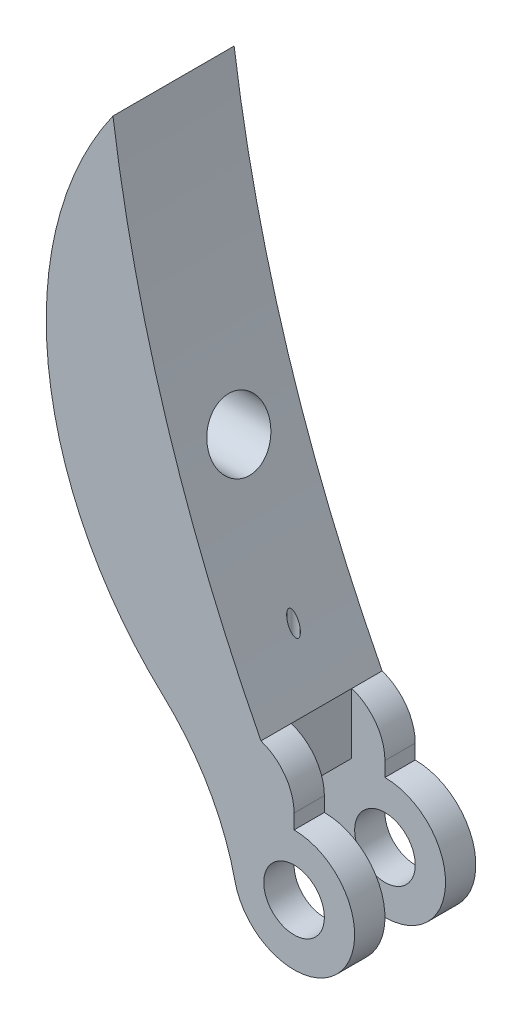
ISO-10303-21;
HEADER;
FILE_DESCRIPTION(('STEP AP214'),'2;1');
FILE_NAME('part.step','',(''),(''),'','','');
FILE_SCHEMA(('AUTOMOTIVE_DESIGN { 1 0 10303 214 1 1 1 1 }'));
ENDSEC;
DATA;
#1=APPLICATION_CONTEXT('core data for automotive mechanical design processes');
#2=APPLICATION_PROTOCOL_DEFINITION('international standard','automotive_design',2000,#1);
#3=PRODUCT_CONTEXT('',#1,'mechanical');
#4=PRODUCT('Part','Part','',(#3));
#5=PRODUCT_RELATED_PRODUCT_CATEGORY('part','',(#4));
#6=PRODUCT_DEFINITION_FORMATION('','',#4);
#7=PRODUCT_DEFINITION_CONTEXT('part definition',#1,'design');
#8=PRODUCT_DEFINITION('design','',#6,#7);
#9=PRODUCT_DEFINITION_SHAPE('','',#8);
#10=(LENGTH_UNIT() NAMED_UNIT(*) SI_UNIT(.MILLI.,.METRE.));
#11=(NAMED_UNIT(*) PLANE_ANGLE_UNIT() SI_UNIT($,.RADIAN.));
#12=(NAMED_UNIT(*) SI_UNIT($,.STERADIAN.) SOLID_ANGLE_UNIT());
#13=UNCERTAINTY_MEASURE_WITH_UNIT(LENGTH_MEASURE(1.E-05),#10,'distance_accuracy_value','');
#14=(GEOMETRIC_REPRESENTATION_CONTEXT(3) GLOBAL_UNCERTAINTY_ASSIGNED_CONTEXT((#13)) GLOBAL_UNIT_ASSIGNED_CONTEXT((#10,
#11,#12)) REPRESENTATION_CONTEXT('',''));
#15=CARTESIAN_POINT('',(0.,0.,0.));
#16=DIRECTION('',(0.,0.,1.));
#17=DIRECTION('',(1.,0.,0.));
#18=AXIS2_PLACEMENT_3D('',#15,#16,#17);
#19=CARTESIAN_POINT('',(0.,0.,5.));
#20=DIRECTION('',(-1.,0.,0.));
#21=DIRECTION('',(0.,-1.,0.));
#22=AXIS2_PLACEMENT_3D('',#19,#20,#21);
#23=PLANE('',#22);
#24=DIRECTION('',(0.,1.,0.));
#25=VECTOR('',#24,1.);
#26=CARTESIAN_POINT('',(0.,0.,0.));
#27=LINE('',#26,#25);
#28=CARTESIAN_POINT('',(0.,2.5,0.));
#29=VERTEX_POINT('',#28);
#30=CARTESIAN_POINT('',(0.,3.1033836070254,0.));
#31=VERTEX_POINT('',#30);
#32=EDGE_CURVE('E227',#29,#31,#27,.T.);
#33=ORIENTED_EDGE('',*,*,#32,.T.);
#34=DIRECTION('',(0.,0.,1.));
#35=VECTOR('',#34,1.);
#36=CARTESIAN_POINT('',(0.,3.1033836070254,5.));
#37=LINE('',#36,#35);
#38=CARTESIAN_POINT('',(0.,3.1033836070254,1.25));
#39=VERTEX_POINT('',#38);
#40=EDGE_CURVE('E257',#31,#39,#37,.T.);
#41=ORIENTED_EDGE('',*,*,#40,.T.);
#42=DIRECTION('',(0.,1.,0.));
#43=VECTOR('',#42,1.);
#44=CARTESIAN_POINT('',(0.,2.5,1.25));
#45=LINE('',#44,#43);
#46=CARTESIAN_POINT('',(0.,2.5,1.25));
#47=VERTEX_POINT('',#46);
#48=EDGE_CURVE('E167',#47,#39,#45,.T.);
#49=ORIENTED_EDGE('',*,*,#48,.F.);
#50=DIRECTION('',(0.,0.,-1.));
#51=VECTOR('',#50,1.);
#52=CARTESIAN_POINT('',(0.,2.5,5.));
#53=LINE('',#52,#51);
#54=EDGE_CURVE('E224',#47,#29,#53,.T.);
#55=ORIENTED_EDGE('',*,*,#54,.T.);
#56=EDGE_LOOP('',(#33,#41,#49,#55));
#57=FACE_BOUND('',#56,.T.);
#58=ADVANCED_FACE('F40',(#57),#23,.F.);
#59=CARTESIAN_POINT('',(0.,0.,5.));
#60=DIRECTION('',(0.,0.,-1.));
#61=DIRECTION('',(-1.,0.,0.));
#62=AXIS2_PLACEMENT_3D('',#59,#60,#61);
#63=CYLINDRICAL_SURFACE('',#62,2.5);
#64=ORIENTED_EDGE('',*,*,#54,.F.);
#65=CARTESIAN_POINT('',(0.,0.,1.25));
#66=DIRECTION('',(0.,0.,-1.));
#67=DIRECTION('',(-1.,0.,0.));
#68=AXIS2_PLACEMENT_3D('',#65,#66,#67);
#69=CIRCLE('',#68,2.5);
#70=CARTESIAN_POINT('',(-2.4392219239649,-0.547901821176943,1.25));
#71=VERTEX_POINT('',#70);
#72=EDGE_CURVE('E192',#47,#71,#69,.T.);
#73=ORIENTED_EDGE('',*,*,#72,.T.);
#74=DIRECTION('',(0.,0.,-1.));
#75=VECTOR('',#74,1.);
#76=CARTESIAN_POINT('',(-2.43922192396489,-0.547901821176942,5.));
#77=LINE('',#76,#75);
#78=CARTESIAN_POINT('',(-2.43922192396489,-0.547901821176942,0.));
#79=VERTEX_POINT('',#78);
#80=EDGE_CURVE('E238',#71,#79,#77,.T.);
#81=ORIENTED_EDGE('',*,*,#80,.T.);
#82=CARTESIAN_POINT('',(0.,0.,0.));
#83=DIRECTION('',(0.,0.,1.));
#84=DIRECTION('',(1.,0.,0.));
#85=AXIS2_PLACEMENT_3D('',#82,#83,#84);
#86=CIRCLE('',#85,2.5);
#87=EDGE_CURVE('E214',#79,#29,#86,.T.);
#88=ORIENTED_EDGE('',*,*,#87,.T.);
#89=EDGE_LOOP('',(#64,#73,#81,#88));
#90=FACE_BOUND('',#89,.T.);
#91=ADVANCED_FACE('F306',(#90),#63,.T.);
#92=CARTESIAN_POINT('',(0.,0.,3.75));
#93=DIRECTION('',(0.,0.,1.));
#94=DIRECTION('',(1.,0.,0.));
#95=AXIS2_PLACEMENT_3D('',#92,#93,#94);
#96=CIRCLE('',#95,2.5);
#97=CARTESIAN_POINT('',(-2.4392219239649,-0.547901821176943,3.75));
#98=VERTEX_POINT('',#97);
#99=CARTESIAN_POINT('',(0.,2.5,3.75));
#100=VERTEX_POINT('',#99);
#101=EDGE_CURVE('E185',#98,#100,#96,.T.);
#102=ORIENTED_EDGE('',*,*,#101,.T.);
#103=CARTESIAN_POINT('',(0.,2.5,5.));
#104=VERTEX_POINT('',#103);
#105=EDGE_CURVE('E232',#104,#100,#53,.T.);
#106=ORIENTED_EDGE('',*,*,#105,.F.);
#107=CARTESIAN_POINT('',(0.,0.,5.));
#108=DIRECTION('',(0.,0.,1.));
#109=DIRECTION('',(1.,0.,0.));
#110=AXIS2_PLACEMENT_3D('',#107,#108,#109);
#111=CIRCLE('',#110,2.5);
#112=CARTESIAN_POINT('',(-2.43922192396489,-0.547901821176942,5.));
#113=VERTEX_POINT('',#112);
#114=EDGE_CURVE('E216',#113,#104,#111,.T.);
#115=ORIENTED_EDGE('',*,*,#114,.F.);
#116=EDGE_CURVE('E239',#113,#98,#77,.T.);
#117=ORIENTED_EDGE('',*,*,#116,.T.);
#118=EDGE_LOOP('',(#102,#106,#115,#117));
#119=FACE_BOUND('',#118,.T.);
#120=ADVANCED_FACE('F295',(#119),#63,.T.);
#121=CARTESIAN_POINT('',(0.,0.,5.));
#122=DIRECTION('',(0.,0.,-1.));
#123=DIRECTION('',(-1.,0.,0.));
#124=AXIS2_PLACEMENT_3D('',#121,#122,#123);
#125=CYLINDRICAL_SURFACE('',#124,1.25);
#126=CARTESIAN_POINT('',(0.,0.,1.25));
#127=DIRECTION('',(0.,0.,-1.));
#128=DIRECTION('',(-1.,0.,0.));
#129=AXIS2_PLACEMENT_3D('',#126,#127,#128);
#130=CIRCLE('',#129,1.25);
#131=CARTESIAN_POINT('',(-1.25,0.,1.25));
#132=VERTEX_POINT('',#131);
#133=EDGE_CURVE('E194',#132,#132,#130,.T.);
#134=ORIENTED_EDGE('',*,*,#133,.F.);
#135=EDGE_LOOP('',(#134));
#136=FACE_BOUND('',#135,.T.);
#137=CARTESIAN_POINT('',(0.,0.,0.));
#138=DIRECTION('',(0.,0.,1.));
#139=DIRECTION('',(1.,0.,0.));
#140=AXIS2_PLACEMENT_3D('',#137,#138,#139);
#141=CIRCLE('',#140,1.25);
#142=CARTESIAN_POINT('',(1.25,0.,0.));
#143=VERTEX_POINT('',#142);
#144=EDGE_CURVE('E219',#143,#143,#141,.T.);
#145=ORIENTED_EDGE('',*,*,#144,.F.);
#146=EDGE_LOOP('',(#145));
#147=FACE_BOUND('',#146,.T.);
#148=ADVANCED_FACE('F313',(#136,#147),#125,.F.);
#149=DIRECTION('',(0.,-1.,0.));
#150=VECTOR('',#149,1.);
#151=CARTESIAN_POINT('',(0.,2.5,3.75));
#152=LINE('',#151,#150);
#153=CARTESIAN_POINT('',(0.,3.1033836070254,3.75));
#154=VERTEX_POINT('',#153);
#155=EDGE_CURVE('E165',#154,#100,#152,.T.);
#156=ORIENTED_EDGE('',*,*,#155,.F.);
#157=DIRECTION('',(0.,0.,1.));
#158=VECTOR('',#157,1.);
#159=CARTESIAN_POINT('',(0.,3.1033836070254,5.));
#160=LINE('',#159,#158);
#161=CARTESIAN_POINT('',(0.,3.1033836070254,5.));
#162=VERTEX_POINT('',#161);
#163=EDGE_CURVE('E54',#154,#162,#160,.T.);
#164=ORIENTED_EDGE('',*,*,#163,.T.);
#165=DIRECTION('',(0.,1.,0.));
#166=VECTOR('',#165,1.);
#167=CARTESIAN_POINT('',(0.,0.,5.));
#168=LINE('',#167,#166);
#169=EDGE_CURVE('E218',#104,#162,#168,.T.);
#170=ORIENTED_EDGE('',*,*,#169,.F.);
#171=ORIENTED_EDGE('',*,*,#105,.T.);
#172=EDGE_LOOP('',(#156,#164,#170,#171));
#173=FACE_BOUND('',#172,.T.);
#174=ADVANCED_FACE('F296',(#173),#23,.F.);
#175=CARTESIAN_POINT('',(0.,0.,3.75));
#176=DIRECTION('',(0.,0.,1.));
#177=DIRECTION('',(1.,0.,0.));
#178=AXIS2_PLACEMENT_3D('',#175,#176,#177);
#179=CIRCLE('',#178,1.25);
#180=CARTESIAN_POINT('',(1.25,0.,3.75));
#181=VERTEX_POINT('',#180);
#182=EDGE_CURVE('E189',#181,#181,#179,.T.);
#183=ORIENTED_EDGE('',*,*,#182,.F.);
#184=EDGE_LOOP('',(#183));
#185=FACE_BOUND('',#184,.T.);
#186=CARTESIAN_POINT('',(0.,0.,5.));
#187=DIRECTION('',(0.,0.,1.));
#188=DIRECTION('',(1.,0.,0.));
#189=AXIS2_PLACEMENT_3D('',#186,#187,#188);
#190=CIRCLE('',#189,1.25);
#191=CARTESIAN_POINT('',(1.25,0.,5.));
#192=VERTEX_POINT('',#191);
#193=EDGE_CURVE('E221',#192,#192,#190,.T.);
#194=ORIENTED_EDGE('',*,*,#193,.T.);
#195=EDGE_LOOP('',(#194));
#196=FACE_BOUND('',#195,.T.);
#197=ADVANCED_FACE('F443',(#185,#196),#125,.F.);
#198=CARTESIAN_POINT('',(0.,0.,5.));
#199=DIRECTION('',(0.,0.,1.));
#200=DIRECTION('',(1.,0.,0.));
#201=AXIS2_PLACEMENT_3D('',#198,#199,#200);
#202=PLANE('',#201);
#203=ORIENTED_EDGE('',*,*,#169,.T.);
#204=CARTESIAN_POINT('',(-2.,3.1033836070254,5.));
#205=DIRECTION('',(0.,0.,1.));
#206=DIRECTION('',(1.,0.,0.));
#207=AXIS2_PLACEMENT_3D('',#204,#205,#206);
#208=CIRCLE('',#207,2.);
#209=CARTESIAN_POINT('',(-1.36529829218757,5.,5.));
#210=VERTEX_POINT('',#209);
#211=EDGE_CURVE('E11',#162,#210,#208,.T.);
#212=ORIENTED_EDGE('',*,*,#211,.T.);
#213=CARTESIAN_POINT('',(51.9615242270662,32.5000000000002,5.));
#214=DIRECTION('',(0.,0.,-1.));
#215=DIRECTION('',(1.,0.,0.));
#216=AXIS2_PLACEMENT_3D('',#213,#214,#215);
#217=CIRCLE('',#216,60.);
#218=CARTESIAN_POINT('',(-7.47255885587743,24.2787003405936,5.));
#219=VERTEX_POINT('',#218);
#220=EDGE_CURVE('E197',#210,#219,#217,.T.);
#221=ORIENTED_EDGE('',*,*,#220,.T.);
#222=CARTESIAN_POINT('',(4.77454803345861,15.6179629100293,5.));
#223=DIRECTION('',(0.,0.,1.));
#224=DIRECTION('',(-1.,0.,0.));
#225=AXIS2_PLACEMENT_3D('',#222,#223,#224);
#226=CIRCLE('',#225,15.);
#227=CARTESIAN_POINT('',(-5.40784655851124,4.60347970048088,5.));
#228=VERTEX_POINT('',#227);
#229=EDGE_CURVE('E201',#219,#228,#226,.T.);
#230=ORIENTED_EDGE('',*,*,#229,.T.);
#231=CARTESIAN_POINT('',(-12.1961096198245,-2.73950910588471,5.));
#232=DIRECTION('',(0.,0.,1.));
#233=DIRECTION('',(1.,0.,0.));
#234=AXIS2_PLACEMENT_3D('',#231,#232,#233);
#235=CIRCLE('',#234,10.);
#236=EDGE_CURVE('E242',#228,#113,#235,.F.);
#237=ORIENTED_EDGE('',*,*,#236,.T.);
#238=ORIENTED_EDGE('',*,*,#114,.T.);
#239=EDGE_LOOP('',(#203,#212,#221,#230,#237,#238));
#240=FACE_BOUND('',#239,.T.);
#241=ORIENTED_EDGE('',*,*,#193,.F.);
#242=EDGE_LOOP('',(#241));
#243=FACE_BOUND('',#242,.T.);
#244=ADVANCED_FACE('F291',(#240,#243),#202,.T.);
#245=CARTESIAN_POINT('',(0.,0.,0.));
#246=DIRECTION('',(0.,0.,1.));
#247=DIRECTION('',(1.,0.,0.));
#248=AXIS2_PLACEMENT_3D('',#245,#246,#247);
#249=PLANE('',#248);
#250=CARTESIAN_POINT('',(51.9615242270662,32.5000000000002,0.));
#251=DIRECTION('',(0.,0.,-1.));
#252=DIRECTION('',(1.,0.,0.));
#253=AXIS2_PLACEMENT_3D('',#250,#251,#252);
#254=CIRCLE('',#253,60.);
#255=CARTESIAN_POINT('',(-1.36529829218757,5.,0.));
#256=VERTEX_POINT('',#255);
#257=CARTESIAN_POINT('',(-7.47255885587743,24.2787003405936,0.));
#258=VERTEX_POINT('',#257);
#259=EDGE_CURVE('E198',#256,#258,#254,.T.);
#260=ORIENTED_EDGE('',*,*,#259,.F.);
#261=CARTESIAN_POINT('',(-2.,3.1033836070254,0.));
#262=DIRECTION('',(0.,0.,1.));
#263=DIRECTION('',(1.,0.,0.));
#264=AXIS2_PLACEMENT_3D('',#261,#262,#263);
#265=CIRCLE('',#264,2.);
#266=EDGE_CURVE('E255',#256,#31,#265,.F.);
#267=ORIENTED_EDGE('',*,*,#266,.T.);
#268=ORIENTED_EDGE('',*,*,#32,.F.);
#269=ORIENTED_EDGE('',*,*,#87,.F.);
#270=CARTESIAN_POINT('',(-12.1961096198245,-2.73950910588471,0.));
#271=DIRECTION('',(0.,0.,1.));
#272=DIRECTION('',(1.,0.,0.));
#273=AXIS2_PLACEMENT_3D('',#270,#271,#272);
#274=CIRCLE('',#273,10.);
#275=CARTESIAN_POINT('',(-5.40784655851124,4.60347970048088,0.));
#276=VERTEX_POINT('',#275);
#277=EDGE_CURVE('E244',#79,#276,#274,.T.);
#278=ORIENTED_EDGE('',*,*,#277,.T.);
#279=CARTESIAN_POINT('',(4.77454803345861,15.6179629100293,0.));
#280=DIRECTION('',(0.,0.,1.));
#281=DIRECTION('',(-1.,0.,0.));
#282=AXIS2_PLACEMENT_3D('',#279,#280,#281);
#283=CIRCLE('',#282,15.);
#284=EDGE_CURVE('E200',#258,#276,#283,.T.);
#285=ORIENTED_EDGE('',*,*,#284,.F.);
#286=EDGE_LOOP('',(#260,#267,#268,#269,#278,#285));
#287=FACE_BOUND('',#286,.T.);
#288=ORIENTED_EDGE('',*,*,#144,.T.);
#289=EDGE_LOOP('',(#288));
#290=FACE_BOUND('',#289,.T.);
#291=ADVANCED_FACE('F277',(#287,#290),#249,.F.);
#292=CARTESIAN_POINT('',(51.9615242270662,32.5000000000002,0.));
#293=DIRECTION('',(0.,0.,1.));
#294=DIRECTION('',(1.,0.,0.));
#295=AXIS2_PLACEMENT_3D('',#292,#293,#294);
#296=CYLINDRICAL_SURFACE('',#295,60.);
#297=CARTESIAN_POINT('',(-2.32196164373379,6.94020419262608,2.5));
#298=CARTESIAN_POINT('',(-2.32196136138954,6.94020359442213,2.49476352569605));
#299=CARTESIAN_POINT('',(-2.322169279654,6.94064515314324,2.48952878734061));
#300=CARTESIAN_POINT('',(-2.32297613259318,6.94235884168519,2.47922691165769));
#301=CARTESIAN_POINT('',(-2.32357548258878,6.94363185370316,2.4741599583619));
#302=CARTESIAN_POINT('',(-2.32529085281114,6.94727581351523,2.46313883622316));
#303=CARTESIAN_POINT('',(-2.32649616825957,6.9498365511298,2.4572623627744));
#304=CARTESIAN_POINT('',(-2.32929078141663,6.95577527998391,2.44604128861554));
#305=CARTESIAN_POINT('',(-2.33088081874106,6.95915484541163,2.44069774072421));
#306=CARTESIAN_POINT('',(-2.33540423794527,6.96877202759188,2.42739093559408));
#307=CARTESIAN_POINT('',(-2.33856028480972,6.97548465579048,2.41985111881234));
#308=CARTESIAN_POINT('',(-2.3452976561143,6.98982240594284,2.40592791129525));
#309=CARTESIAN_POINT('',(-2.34888014921233,6.99745003588463,2.39954782538247));
#310=CARTESIAN_POINT('',(-2.36005819263996,7.02126399530669,2.3817358538237));
#311=CARTESIAN_POINT('',(-2.36804995092609,7.03830839966483,2.37171599986154));
#312=CARTESIAN_POINT('',(-2.38449431930153,7.07342629249027,2.35424338639864));
#313=CARTESIAN_POINT('',(-2.39294814444072,7.09150250031506,2.34679781343702));
#314=CARTESIAN_POINT('',(-2.41087311081619,7.12988185976551,2.33327727121904));
#315=CARTESIAN_POINT('',(-2.42036720333051,7.15023875192838,2.32738666796889));
#316=CARTESIAN_POINT('',(-2.43950691354682,7.19133887907145,2.31747124445226));
#317=CARTESIAN_POINT('',(-2.44915268593299,7.2120825130749,2.31344847640466));
#318=CARTESIAN_POINT('',(-2.47823663061546,7.27472395162113,2.30376196050304));
#319=CARTESIAN_POINT('',(-2.49778793553703,7.31696059504844,2.30050255334795));
#320=CARTESIAN_POINT('',(-2.52821183746662,7.38288732005696,2.29980368575831));
#321=CARTESIAN_POINT('',(-2.53912359537868,7.40657324077488,2.30043643450778));
#322=CARTESIAN_POINT('',(-2.56087085934173,7.45386039795276,2.30351303364077));
#323=CARTESIAN_POINT('',(-2.5717063985157,7.47746166869335,2.305956041033));
#324=CARTESIAN_POINT('',(-2.59322767050089,7.52441767634398,2.31278762668982));
#325=CARTESIAN_POINT('',(-2.60391356233635,7.54777266721256,2.31717394747849));
#326=CARTESIAN_POINT('',(-2.62504714082712,7.59403947027629,2.32819786287044));
#327=CARTESIAN_POINT('',(-2.63549514842062,7.61695187236661,2.33483220565995));
#328=CARTESIAN_POINT('',(-2.6540992733419,7.65781654607897,2.34949152702466));
#329=CARTESIAN_POINT('',(-2.66232438895895,7.67590803582767,2.35703853715002));
#330=CARTESIAN_POINT('',(-2.67826508826075,7.7110147960899,2.37465352401671));
#331=CARTESIAN_POINT('',(-2.68598340600498,7.72803581610099,2.3847062748166));
#332=CARTESIAN_POINT('',(-2.69569445426026,7.74947506358066,2.40080316946277));
#333=CARTESIAN_POINT('',(-2.69815168101342,7.75490224515216,2.4052137298851));
#334=CARTESIAN_POINT('',(-2.70288553527584,7.7653615760312,2.41459292270019));
#335=CARTESIAN_POINT('',(-2.70516189800866,7.77039314607388,2.41956234846139));
#336=CARTESIAN_POINT('',(-2.70947228308178,7.77992378150738,2.43019306076237));
#337=CARTESIAN_POINT('',(-2.71150363177861,7.78441696898091,2.43586081542862));
#338=CARTESIAN_POINT('',(-2.71516353805327,7.7925146018036,2.44791903965571));
#339=CARTESIAN_POINT('',(-2.71679321820026,7.79612152396693,2.45430742058718));
#340=CARTESIAN_POINT('',(-2.71902312069745,7.80105778482012,2.46553609963636));
#341=CARTESIAN_POINT('',(-2.71978546998585,7.80274566013377,2.47018503659502));
#342=CARTESIAN_POINT('',(-2.72098886889633,7.80541023480895,2.47972261665259));
#343=CARTESIAN_POINT('',(-2.72143030408922,7.80638778760575,2.48461096453876));
#344=CARTESIAN_POINT('',(-2.72194882252983,7.80753605499227,2.49453159203691));
#345=CARTESIAN_POINT('',(-2.72202382945633,7.80770217167736,2.49956452968871));
#346=CARTESIAN_POINT('',(-2.72179491987616,7.80719523551789,2.50957984548304));
#347=CARTESIAN_POINT('',(-2.72149086465847,7.80652187548185,2.51456220444446));
#348=CARTESIAN_POINT('',(-2.72056932027007,7.8044812488864,2.52400080207979));
#349=CARTESIAN_POINT('',(-2.71997378716688,7.80316259146186,2.52847008189676));
#350=CARTESIAN_POINT('',(-2.71852920724884,7.79996438233797,2.53715655054476));
#351=CARTESIAN_POINT('',(-2.71768006450285,7.79808461839294,2.54137364325697));
#352=CARTESIAN_POINT('',(-2.71513377893701,7.79244884524797,2.55228652249555));
#353=CARTESIAN_POINT('',(-2.71325175694452,7.78828423514159,2.55872724622378));
#354=CARTESIAN_POINT('',(-2.70910518786772,7.77911196794341,2.5708411442178));
#355=CARTESIAN_POINT('',(-2.70683934966578,7.77410146555597,2.57651160738255));
#356=CARTESIAN_POINT('',(-2.70003420591458,7.75905937916352,2.59169120534302));
#357=CARTESIAN_POINT('',(-2.6951915071753,7.74836220992898,2.60039582395342));
#358=CARTESIAN_POINT('',(-2.68506427621296,7.72601126429245,2.61612311173375));
#359=CARTESIAN_POINT('',(-2.67977867585834,7.71435517660588,2.62314154717561));
#360=CARTESIAN_POINT('',(-2.66837983635979,7.68924041852573,2.6365537949119));
#361=CARTESIAN_POINT('',(-2.66223770543445,7.6757203828932,2.64280663077808));
#362=CARTESIAN_POINT('',(-2.64975013306726,7.64826079363283,2.65407953739788));
#363=CARTESIAN_POINT('',(-2.64340447009477,7.63432078396773,2.65909820956067));
#364=CARTESIAN_POINT('',(-2.62413082591758,7.59202495364353,2.67265710009537));
#365=CARTESIAN_POINT('',(-2.61100023361701,7.56326836333814,2.67966393510922));
#366=CARTESIAN_POINT('',(-2.58514657220383,7.50676840912191,2.69023969186993));
#367=CARTESIAN_POINT('',(-2.57243580757128,7.47904597545825,2.69396255013052));
#368=CARTESIAN_POINT('',(-2.54687250213483,7.4234048690524,2.69886960105336));
#369=CARTESIAN_POINT('',(-2.53401982301155,7.39548601667532,2.70005104701392));
#370=CARTESIAN_POINT('',(-2.50832341791932,7.33978069298364,2.69994583638455));
#371=CARTESIAN_POINT('',(-2.49547984358773,7.31199412182921,2.6986685433716));
#372=CARTESIAN_POINT('',(-2.4698508048617,7.25665752798643,2.69353446049066));
#373=CARTESIAN_POINT('',(-2.45706528917721,7.22910726112323,2.68968077286711));
#374=CARTESIAN_POINT('',(-2.43699335125796,7.18594081483924,2.68122943693626));
#375=CARTESIAN_POINT('',(-2.4296459477168,7.17015779932233,2.67761892280448));
#376=CARTESIAN_POINT('',(-2.41504041258753,7.13881870208126,2.669230680818));
#377=CARTESIAN_POINT('',(-2.40778246660005,7.12326308268544,2.66445085265722));
#378=CARTESIAN_POINT('',(-2.39209402775152,7.08967556460453,2.65247845012773));
#379=CARTESIAN_POINT('',(-2.38369925808291,7.07172713698552,2.64500136162797));
#380=CARTESIAN_POINT('',(-2.36739147597961,7.03690353815521,2.62748548337485));
#381=CARTESIAN_POINT('',(-2.35947643319942,7.02002382794671,2.6174585829869));
#382=CARTESIAN_POINT('',(-2.34931037141213,6.99836692676509,2.60108701048448));
#383=CARTESIAN_POINT('',(-2.34660343205918,6.9926028790587,2.59634152851839));
#384=CARTESIAN_POINT('',(-2.34140422083258,6.98153611580195,2.58620726414304));
#385=CARTESIAN_POINT('',(-2.33891225455417,6.97623405688811,2.58081759110838));
#386=CARTESIAN_POINT('',(-2.33422019511671,6.96625432030159,2.56922960595063));
#387=CARTESIAN_POINT('',(-2.33202413552589,6.96158526683178,2.56302203599778));
#388=CARTESIAN_POINT('',(-2.32813499040628,6.95331874983383,2.54978342106727));
#389=CARTESIAN_POINT('',(-2.32644038087946,6.94971803932548,2.54275496365869));
#390=CARTESIAN_POINT('',(-2.32410782781837,6.94476260918012,2.5297670971401));
#391=CARTESIAN_POINT('',(-2.32331286092246,6.94307405423415,2.52396618557492));
#392=CARTESIAN_POINT('',(-2.32224052030116,6.9407964412581,2.51210900098293));
#393=CARTESIAN_POINT('',(-2.32196197012246,6.94020488414715,2.50605334059531));
#394=CARTESIAN_POINT('',(-2.32196164373379,6.94020419262608,2.5));
#395=B_SPLINE_CURVE_WITH_KNOTS('',3,(#297,#298,#299,#300,#301,#302,#303,#304,#305,#306,#307,
#308,#309,#310,#311,#312,#313,#314,#315,#316,#317,#318,#319,#320,#321,#322,#323,#324,#325,#326,
#327,#328,#329,#330,#331,#332,#333,#334,#335,#336,#337,#338,#339,#340,#341,#342,#343,#344,#345,
#346,#347,#348,#349,#350,#351,#352,#353,#354,#355,#356,#357,#358,#359,#360,#361,#362,#363,#364,
#365,#366,#367,#368,#369,#370,#371,#372,#373,#374,#375,#376,#377,#378,#379,#380,#381,#382,#383,
#384,#385,#386,#387,#388,#389,#390,#391,#392,#393,#394),.UNSPECIFIED.,.T.,.F.,(4,2,2,2,2,2,2,2,
2,2,2,2,2,2,2,2,2,2,2,2,2,2,2,2,2,2,2,2,2,2,2,2,2,2,2,2,2,2,2,2,2,2,2,2,2,2,2,2,4),(0.,
0.0156851003232683,0.0313868701081665,0.0508445370485733,0.0703399121860191,0.101891211805093,
0.133531058197053,0.197151456846751,0.260948055039128,0.330502868821145,0.400133923744533,
0.539640686518387,0.617857255812858,0.696037424517326,0.774127011348619,0.852104118682394,
0.915784792317182,0.979087565867368,1.00130025314615,1.02354488150703,1.04601370170861,
1.06841899606373,1.08337599684275,1.09831499729991,1.11333855037902,1.12836760267248,
1.14240707730582,1.15645186929304,1.1800063875774,1.20364177422922,1.24724635187657,
1.29095929525859,1.33922057003801,1.38753628646822,1.48443543142216,1.57650526185811,
1.66867454942098,1.76049352445061,1.85220213862595,1.90551122317487,1.95891677303953,
2.02235010278524,2.08549290953859,2.1092870898185,2.13311455573684,2.1572395813509,
2.18129051527509,2.19946387225265,2.21759577723627),.UNSPECIFIED.);
#396=CARTESIAN_POINT('',(-2.32196164373379,6.94020419262608,2.5));
#397=VERTEX_POINT('',#396);
#398=EDGE_CURVE('E349',#397,#397,#395,.T.);
#399=ORIENTED_EDGE('',*,*,#398,.F.);
#400=EDGE_LOOP('',(#399));
#401=FACE_BOUND('',#400,.T.);
#402=CARTESIAN_POINT('',(-4.78131673106696,13.,1.25));
#403=CARTESIAN_POINT('',(-4.8063963827345,13.0729796534861,1.25000272763136));
#404=CARTESIAN_POINT('',(-4.83135221387458,13.1460605471817,1.25640662139332));
#405=CARTESIAN_POINT('',(-4.88032199740955,13.2903581254865,1.28198033828814));
#406=CARTESIAN_POINT('',(-4.90433479218796,13.3615724852641,1.30116536215572));
#407=CARTESIAN_POINT('',(-4.95075773093659,13.5000657806178,1.35201135985412));
#408=CARTESIAN_POINT('',(-4.97316631163904,13.5673408661518,1.38368431247701));
#409=CARTESIAN_POINT('',(-5.01569638639,13.6957210272846,1.45884618475642));
#410=CARTESIAN_POINT('',(-5.03581875599498,13.7568284639169,1.50233055917989));
#411=CARTESIAN_POINT('',(-5.07258858593316,13.8690214865038,1.59855984439768));
#412=CARTESIAN_POINT('',(-5.08932394012344,13.920357652028,1.65097851707741));
#413=CARTESIAN_POINT('',(-5.11954762036077,14.0134200723654,1.7645645680773));
#414=CARTESIAN_POINT('',(-5.13303680350047,14.0551488637054,1.82572963025736));
#415=CARTESIAN_POINT('',(-5.15572682531099,14.1255357738721,1.95172040099528));
#416=CARTESIAN_POINT('',(-5.16511058989371,14.1547498591334,2.01620268010436));
#417=CARTESIAN_POINT('',(-5.18024682824065,14.2019503519365,2.14955268112043));
#418=CARTESIAN_POINT('',(-5.18600032452449,14.219939921016,2.21841916212922));
#419=CARTESIAN_POINT('',(-5.19352602056934,14.2434839598801,2.35549244344752));
#420=CARTESIAN_POINT('',(-5.19545382767237,14.2495244171905,2.42360759257403));
#421=CARTESIAN_POINT('',(-5.19574020696487,14.2504212782885,2.55991454046212));
#422=CARTESIAN_POINT('',(-5.19409925563831,14.2452791751193,2.62810632777634));
#423=CARTESIAN_POINT('',(-5.18735755633348,14.2241846117421,2.76144449563656));
#424=CARTESIAN_POINT('',(-5.18231485342129,14.2084135211875,2.82662267449933));
#425=CARTESIAN_POINT('',(-5.16898045992035,14.1668085747525,2.95332603855226));
#426=CARTESIAN_POINT('',(-5.16068868579522,14.1409744601433,3.01485112977159));
#427=CARTESIAN_POINT('',(-5.14096901835616,14.0797310510756,3.13339438053214));
#428=CARTESIAN_POINT('',(-5.1295025367481,14.0442040230142,3.19034517740439));
#429=CARTESIAN_POINT('',(-5.10380101777898,13.9648876875453,3.29745538019462));
#430=CARTESIAN_POINT('',(-5.089565571284,13.9210971591764,3.34761378062855));
#431=CARTESIAN_POINT('',(-5.0581285972879,13.8248335273971,3.4417246222712));
#432=CARTESIAN_POINT('',(-5.04083712956083,13.7721000184126,3.48538041361145));
#433=CARTESIAN_POINT('',(-5.00413165685665,13.6607461599535,3.56326592738177));
#434=CARTESIAN_POINT('',(-4.98471718233615,13.6021245084385,3.59749355868025));
#435=CARTESIAN_POINT('',(-4.9432577716403,13.4776371223394,3.6573069793425));
#436=CARTESIAN_POINT('',(-4.92113080794287,13.411557697326,3.68239123259057));
#437=CARTESIAN_POINT('',(-4.87563778427088,13.2765223436494,3.72105334938448));
#438=CARTESIAN_POINT('',(-4.8522714343636,13.2075657427335,3.73462850785241));
#439=CARTESIAN_POINT('',(-4.80385456100876,13.0655554645816,3.75040949516894));
#440=CARTESIAN_POINT('',(-4.77877494078736,12.9924537725744,3.75209689488801));
#441=CARTESIAN_POINT('',(-4.72858362965909,12.8470717379657,3.74274737657438));
#442=CARTESIAN_POINT('',(-4.70347193406075,12.7747915358236,3.73170831464641));
#443=CARTESIAN_POINT('',(-4.65344484858093,12.6316549733062,3.69680896954653));
#444=CARTESIAN_POINT('',(-4.6285426359775,12.5608531422383,3.67270497975698));
#445=CARTESIAN_POINT('',(-4.58022536599265,12.4242483155565,3.61202278281612));
#446=CARTESIAN_POINT('',(-4.55681027917712,12.3584452209994,3.5754448226487));
#447=CARTESIAN_POINT('',(-4.51268270184972,12.2350505850506,3.49137586468519));
#448=CARTESIAN_POINT('',(-4.49192955239172,12.1773338163432,3.44409052254298));
#449=CARTESIAN_POINT('',(-4.45344642747418,12.0707488571439,3.33938520872123));
#450=CARTESIAN_POINT('',(-4.43571553956657,12.0218779957156,3.28196830654376));
#451=CARTESIAN_POINT('',(-4.40486579374929,11.9371205307969,3.16175186643884));
#452=CARTESIAN_POINT('',(-4.3915565049177,11.9006950323573,3.09938156738178));
#453=CARTESIAN_POINT('',(-4.36894798072733,11.8389499415572,2.96869856123512));
#454=CARTESIAN_POINT('',(-4.35964704746599,11.8136256467507,2.90038838498807));
#455=CARTESIAN_POINT('',(-4.34593399141889,11.7763294389906,2.76421857739089));
#456=CARTESIAN_POINT('',(-4.34126099354725,11.7636447353575,2.69657995107954));
#457=CARTESIAN_POINT('',(-4.33606991289363,11.7495553413481,2.55998610903353));
#458=CARTESIAN_POINT('',(-4.33555076983366,11.7481477724653,2.49103123377827));
#459=CARTESIAN_POINT('',(-4.3386325506774,11.7565103568452,2.35640762155296));
#460=CARTESIAN_POINT('',(-4.3420855974732,11.7658793190922,2.29071004287794));
#461=CARTESIAN_POINT('',(-4.35272045822063,11.7947813327176,2.1619111628844));
#462=CARTESIAN_POINT('',(-4.35990224043331,11.8143142975801,2.0988098394715));
#463=CARTESIAN_POINT('',(-4.37775327487422,11.8629827284155,1.97650044235841));
#464=CARTESIAN_POINT('',(-4.38844406909213,11.8921775181867,1.91731920197661));
#465=CARTESIAN_POINT('',(-4.41288710093767,11.9591379542041,1.80473134621729));
#466=CARTESIAN_POINT('',(-4.42663972807356,11.9969046909348,1.75132546683243));
#467=CARTESIAN_POINT('',(-4.4573745284612,12.0816265460629,1.6493104323837));
#468=CARTESIAN_POINT('',(-4.47446996034099,12.1289064023581,1.60100544423607));
#469=CARTESIAN_POINT('',(-4.51089974142304,12.230115391762,1.51294298408922));
#470=CARTESIAN_POINT('',(-4.5302352152139,12.284047865632,1.47318983430792));
#471=CARTESIAN_POINT('',(-4.57175421443224,12.4004362196487,1.40091426253259));
#472=CARTESIAN_POINT('',(-4.59403852703987,12.4632074666352,1.36895807901942));
#473=CARTESIAN_POINT('',(-4.63977947894317,12.5927870638445,1.316122120859));
#474=CARTESIAN_POINT('',(-4.66323508028377,12.6595918502914,1.29523272333306));
#475=CARTESIAN_POINT('',(-4.70256175586732,12.7722628036364,1.2700653445983));
#476=CARTESIAN_POINT('',(-4.71828601823233,12.8174842446442,1.26255032206629));
#477=CARTESIAN_POINT('',(-4.74979534527309,12.9084571583666,1.25251670389834));
#478=CARTESIAN_POINT('',(-4.76558041212206,12.9542086501452,1.24999828853775));
#479=CARTESIAN_POINT('',(-4.78131673106696,13.,1.25));
#480=B_SPLINE_CURVE_WITH_KNOTS('',3,(#402,#403,#404,#405,#406,#407,#408,#409,#410,#411,#412,
#413,#414,#415,#416,#417,#418,#419,#420,#421,#422,#423,#424,#425,#426,#427,#428,#429,#430,#431,
#432,#433,#434,#435,#436,#437,#438,#439,#440,#441,#442,#443,#444,#445,#446,#447,#448,#449,#450,
#451,#452,#453,#454,#455,#456,#457,#458,#459,#460,#461,#462,#463,#464,#465,#466,#467,#468,#469,
#470,#471,#472,#473,#474,#475,#476,#477,#478,#479),.UNSPECIFIED.,.T.,.F.,(4,2,2,2,2,2,2,2,2,2,2,
2,2,2,2,2,2,2,2,2,2,2,2,2,2,2,2,2,2,2,2,2,2,2,2,2,2,2,4),(0.,0.231334781883405,
0.462945185031525,0.694778298384513,0.926522324552393,1.15113324351319,1.37568479280424,
1.58883768435492,1.80193051135844,2.00616219450811,2.21036661127028,2.41117192260291,
2.61198239714946,2.81534982084786,3.01874731636213,3.22963690888358,3.44057323835528,
3.66177337818303,3.8830254941104,4.11386991115006,4.34475322184235,4.58009945373504,
4.81544102605605,5.04659709777854,5.27768325730495,5.49687361164852,5.71597102749601,
5.92186275202387,6.12770192068733,6.32611940887126,6.52453520815546,6.72419261521684,
6.92387543604056,7.13212675173199,7.34048307452734,7.56115416890339,7.78163306736947,
7.92677968358498,8.07193153653037),.UNSPECIFIED.);
#481=CARTESIAN_POINT('',(-4.78131673106696,13.,1.25));
#482=VERTEX_POINT('',#481);
#483=EDGE_CURVE('E170',#482,#482,#480,.T.);
#484=ORIENTED_EDGE('',*,*,#483,.F.);
#485=EDGE_LOOP('',(#484));
#486=FACE_BOUND('',#485,.T.);
#487=DIRECTION('',(0.,0.,1.));
#488=VECTOR('',#487,1.);
#489=CARTESIAN_POINT('',(-1.36529829218757,5.,0.));
#490=LINE('',#489,#488);
#491=CARTESIAN_POINT('',(-1.36529829218757,5.,1.25));
#492=VERTEX_POINT('',#491);
#493=EDGE_CURVE('E211',#256,#492,#490,.T.);
#494=ORIENTED_EDGE('',*,*,#493,.F.);
#495=ORIENTED_EDGE('',*,*,#259,.T.);
#496=DIRECTION('',(0.,0.,1.));
#497=VECTOR('',#496,1.);
#498=CARTESIAN_POINT('',(-7.47255885587743,24.2787003405936,0.));
#499=LINE('',#498,#497);
#500=EDGE_CURVE('E204',#258,#219,#499,.T.);
#501=ORIENTED_EDGE('',*,*,#500,.T.);
#502=ORIENTED_EDGE('',*,*,#220,.F.);
#503=CARTESIAN_POINT('',(-1.36529829218757,5.,3.75));
#504=VERTEX_POINT('',#503);
#505=EDGE_CURVE('E210',#504,#210,#490,.T.);
#506=ORIENTED_EDGE('',*,*,#505,.F.);
#507=EDGE_CURVE('E215',#492,#504,#490,.T.);
#508=ORIENTED_EDGE('',*,*,#507,.F.);
#509=EDGE_LOOP('',(#494,#495,#501,#502,#506,#508));
#510=FACE_BOUND('',#509,.T.);
#511=ADVANCED_FACE('F272',(#401,#486,#510),#296,.F.);
#512=CARTESIAN_POINT('',(4.77454803345861,15.6179629100293,0.));
#513=DIRECTION('',(0.,0.,1.));
#514=DIRECTION('',(1.,0.,0.));
#515=AXIS2_PLACEMENT_3D('',#512,#513,#514);
#516=CYLINDRICAL_SURFACE('',#515,15.);
#517=CARTESIAN_POINT('',(-9.99522753022925,13.,1.25));
#518=CARTESIAN_POINT('',(-9.98254276672776,12.9284406956158,1.25000310361887));
#519=CARTESIAN_POINT('',(-9.96932455587451,12.8569219300883,1.25616451146006));
#520=CARTESIAN_POINT('',(-9.94224506698004,12.7160384867381,1.28057804771876));
#521=CARTESIAN_POINT('',(-9.92838296784213,12.6466767587475,1.29884603144631));
#522=CARTESIAN_POINT('',(-9.90055348606843,12.5121440591624,1.34691999783588));
#523=CARTESIAN_POINT('',(-9.88658618047146,12.4469703017635,1.37671821606381));
#524=CARTESIAN_POINT('',(-9.85913348606748,12.3225986506194,1.44703744172307));
#525=CARTESIAN_POINT('',(-9.84564797772729,12.263399267896,1.48755576824663));
#526=CARTESIAN_POINT('',(-9.81978137395313,12.1525921992075,1.57829920848056));
#527=CARTESIAN_POINT('',(-9.80740132526742,12.1009916791387,1.62853338250341));
#528=CARTESIAN_POINT('',(-9.78441341470599,12.007008962456,1.73734959966899));
#529=CARTESIAN_POINT('',(-9.77380545808179,11.9646262729556,1.79593119618942));
#530=CARTESIAN_POINT('',(-9.75516043782074,11.8911699549315,1.91861475337994));
#531=CARTESIAN_POINT('',(-9.74707778969734,11.8598942173755,1.9825886464461));
#532=CARTESIAN_POINT('',(-9.73370459044144,11.8085909945395,2.11517036906423));
#533=CARTESIAN_POINT('',(-9.7284134502503,11.7885611361184,2.18377721752935));
#534=CARTESIAN_POINT('',(-9.72107909283138,11.7608922333592,2.3214239501777));
#535=CARTESIAN_POINT('',(-9.71894161211566,11.7528934288074,2.3903866094748));
#536=CARTESIAN_POINT('',(-9.71774694704173,11.7484160706251,2.52870737880728));
#537=CARTESIAN_POINT('',(-9.71868937506699,11.7519360673161,2.59806543798359));
#538=CARTESIAN_POINT('',(-9.72355033934543,11.7702066501931,2.73393561380978));
#539=CARTESIAN_POINT('',(-9.72741663716906,11.7847601214344,2.80047627504838));
#540=CARTESIAN_POINT('',(-9.73783043732429,11.8243779029081,2.93012554085955));
#541=CARTESIAN_POINT('',(-9.74437803935386,11.8494426039765,2.99323401771558));
#542=CARTESIAN_POINT('',(-9.7598597033384,11.9095992026965,3.11496581193795));
#543=CARTESIAN_POINT('',(-9.76881750498213,11.9447911037519,3.17353661232602));
#544=CARTESIAN_POINT('',(-9.78860339015284,12.0240396749882,3.28397894337348));
#545=CARTESIAN_POINT('',(-9.79943173737264,12.0680975951661,3.33584952769187));
#546=CARTESIAN_POINT('',(-9.82275298339385,12.1652302152818,3.43301257496525));
#547=CARTESIAN_POINT('',(-9.83528481781392,12.2185279181236,3.4780727666353));
#548=CARTESIAN_POINT('',(-9.86116314503639,12.3317300667085,3.5586520773073));
#549=CARTESIAN_POINT('',(-9.87450975588609,12.3916354708148,3.59416980972313));
#550=CARTESIAN_POINT('',(-9.90178273761005,12.5180285743188,3.65553472003068));
#551=CARTESIAN_POINT('',(-9.91571525569664,12.5846435993731,3.68111726728591));
#552=CARTESIAN_POINT('',(-9.94327338727777,12.7213114200874,3.72061160272589));
#553=CARTESIAN_POINT('',(-9.95689898581865,12.7913643827231,3.73452282345535));
#554=CARTESIAN_POINT('',(-9.98344151570379,12.9333790758393,3.75027777172465));
#555=CARTESIAN_POINT('',(-9.9963538686547,13.0053495329222,3.75205090216793));
#556=CARTESIAN_POINT('',(-10.020997878415,13.1487298055077,3.74319649189983));
#557=CARTESIAN_POINT('',(-10.0327296014212,13.220139652236,3.73256964686474));
#558=CARTESIAN_POINT('',(-10.0546209393592,13.359496548774,3.69930669041473));
#559=CARTESIAN_POINT('',(-10.0647966322111,13.4274733415243,3.6768058729318));
#560=CARTESIAN_POINT('',(-10.0835854194194,13.5587709140611,3.62043644526946));
#561=CARTESIAN_POINT('',(-10.092198642802,13.6220920780451,3.5865687744057));
#562=CARTESIAN_POINT('',(-10.1077059632323,13.7412429327932,3.50897859594328));
#563=CARTESIAN_POINT('',(-10.1146238810867,13.7971706407631,3.46541132193934));
#564=CARTESIAN_POINT('',(-10.1269488288054,13.9009516468375,3.36935860817076));
#565=CARTESIAN_POINT('',(-10.1323559384094,13.9488053710302,3.3168736393129));
#566=CARTESIAN_POINT('',(-10.1417103355707,14.0345848168557,3.20502116760461));
#567=CARTESIAN_POINT('',(-10.1456709890778,14.072600440228,3.14572370217935));
#568=CARTESIAN_POINT('',(-10.1523170775335,14.138169395061,3.02153665240751));
#569=CARTESIAN_POINT('',(-10.1550025405237,14.1657229565807,2.95664719106657));
#570=CARTESIAN_POINT('',(-10.1591941413625,14.2094780985507,2.82336563360644));
#571=CARTESIAN_POINT('',(-10.1607043897087,14.2257192249105,2.75498664534085));
#572=CARTESIAN_POINT('',(-10.1626300454665,14.246532246545,2.61646006939344));
#573=CARTESIAN_POINT('',(-10.1630454571249,14.2511041870837,2.54631248857294));
#574=CARTESIAN_POINT('',(-10.1628020151223,14.2484465614342,2.40629491565298));
#575=CARTESIAN_POINT('',(-10.1621439498407,14.2412256561044,2.33642475758079));
#576=CARTESIAN_POINT('',(-10.1597229503276,14.2152089469556,2.19889358699257));
#577=CARTESIAN_POINT('',(-10.1579600175508,14.1964131583771,2.13123257156793));
#578=CARTESIAN_POINT('',(-10.1532514441346,14.1477944359373,2.00003803744783));
#579=CARTESIAN_POINT('',(-10.1503057771294,14.1179712562523,1.93650461080212));
#580=CARTESIAN_POINT('',(-10.1431254874436,14.0481724089351,1.81536814336695));
#581=CARTESIAN_POINT('',(-10.1388909207518,14.0081971823125,1.75776484512279));
#582=CARTESIAN_POINT('',(-10.1290197206788,13.9192379021386,1.65006870701832));
#583=CARTESIAN_POINT('',(-10.1233821468815,13.8702478118123,1.59998094095769));
#584=CARTESIAN_POINT('',(-10.1106206264086,13.7647026581278,1.50873987265535));
#585=CARTESIAN_POINT('',(-10.1034963252254,13.7081457916409,1.46758870611527));
#586=CARTESIAN_POINT('',(-10.087703211141,13.5888947205173,1.39519674992202));
#587=CARTESIAN_POINT('',(-10.0790282332132,13.526176485699,1.36399695564544));
#588=CARTESIAN_POINT('',(-10.0602111366414,13.3966600667904,1.31256319950104));
#589=CARTESIAN_POINT('',(-10.0500706257548,13.3298663994441,1.29231733465055));
#590=CARTESIAN_POINT('',(-10.0324236886551,13.2188996205193,1.2685247507136));
#591=CARTESIAN_POINT('',(-10.0253056690362,13.1753624423682,1.26158055182854));
#592=CARTESIAN_POINT('',(-10.0106012938289,13.0878784160382,1.25231722773266));
#593=CARTESIAN_POINT('',(-10.0030149390395,13.0439315685585,1.24999809463149));
#594=CARTESIAN_POINT('',(-9.99522753022925,13.,1.25));
#595=B_SPLINE_CURVE_WITH_KNOTS('',3,(#517,#518,#519,#520,#521,#522,#523,#524,#525,#526,#527,
#528,#529,#530,#531,#532,#533,#534,#535,#536,#537,#538,#539,#540,#541,#542,#543,#544,#545,#546,
#547,#548,#549,#550,#551,#552,#553,#554,#555,#556,#557,#558,#559,#560,#561,#562,#563,#564,#565,
#566,#567,#568,#569,#570,#571,#572,#573,#574,#575,#576,#577,#578,#579,#580,#581,#582,#583,#584,
#585,#586,#587,#588,#589,#590,#591,#592,#593,#594),.UNSPECIFIED.,.T.,.F.,(4,2,2,2,2,2,2,2,2,2,2,
2,2,2,2,2,2,2,2,2,2,2,2,2,2,2,2,2,2,2,2,2,2,2,2,2,2,2,4),(0.,0.217860545256266,
0.436006975701833,0.654006761763118,0.871952081415697,1.09010163001535,1.3082395110738,
1.52217564456659,1.73606661559263,1.94342485009651,2.15075698889707,2.3544699161616,
2.5581904186987,2.76399601567896,2.96983064900814,3.18158896954096,3.39337804341831,
3.61047420517672,3.82758092145346,4.04594930066394,4.26430542933392,4.48022564874476,
4.69612802968118,4.90879602964614,5.12145280297707,5.33209158833681,5.54272574151388,
5.7526198152832,5.96251307488473,6.17225225476281,6.38199115848214,6.59173473800471,
6.80146920773049,7.01134463999683,7.22127017400897,7.43204966395228,7.6425996500068,
7.77634846003952,7.91009704189721),.UNSPECIFIED.);
#596=CARTESIAN_POINT('',(-9.99522753022925,13.,1.25));
#597=VERTEX_POINT('',#596);
#598=EDGE_CURVE('E44',#597,#597,#595,.T.);
#599=ORIENTED_EDGE('',*,*,#598,.F.);
#600=EDGE_LOOP('',(#599));
#601=FACE_BOUND('',#600,.T.);
#602=ORIENTED_EDGE('',*,*,#284,.T.);
#603=DIRECTION('',(0.,0.,1.));
#604=VECTOR('',#603,1.);
#605=CARTESIAN_POINT('',(-5.40784655851124,4.60347970048088,0.));
#606=LINE('',#605,#604);
#607=EDGE_CURVE('E235',#276,#228,#606,.T.);
#608=ORIENTED_EDGE('',*,*,#607,.T.);
#609=ORIENTED_EDGE('',*,*,#229,.F.);
#610=ORIENTED_EDGE('',*,*,#500,.F.);
#611=EDGE_LOOP('',(#602,#608,#609,#610));
#612=FACE_BOUND('',#611,.T.);
#613=ADVANCED_FACE('F283',(#601,#612),#516,.T.);
#614=CARTESIAN_POINT('',(-12.1961096198245,-2.73950910588471,5.));
#615=DIRECTION('',(0.,0.,-1.));
#616=DIRECTION('',(-1.,0.,0.));
#617=AXIS2_PLACEMENT_3D('',#614,#615,#616);
#618=CYLINDRICAL_SURFACE('',#617,10.);
#619=ORIENTED_EDGE('',*,*,#80,.F.);
#620=CARTESIAN_POINT('',(-12.1961096198245,-2.73950910588471,1.25));
#621=DIRECTION('',(0.,0.,-1.));
#622=DIRECTION('',(-1.,0.,0.));
#623=AXIS2_PLACEMENT_3D('',#620,#621,#622);
#624=CIRCLE('',#623,10.);
#625=CARTESIAN_POINT('',(-3.67862499528001,2.5,1.25));
#626=VERTEX_POINT('',#625);
#627=EDGE_CURVE('E252',#71,#626,#624,.F.);
#628=ORIENTED_EDGE('',*,*,#627,.T.);
#629=DIRECTION('',(0.,0.,-1.));
#630=VECTOR('',#629,1.);
#631=CARTESIAN_POINT('',(-3.67862499528001,2.5,5.));
#632=LINE('',#631,#630);
#633=CARTESIAN_POINT('',(-3.67862499528001,2.5,3.75));
#634=VERTEX_POINT('',#633);
#635=EDGE_CURVE('E246',#626,#634,#632,.F.);
#636=ORIENTED_EDGE('',*,*,#635,.T.);
#637=CARTESIAN_POINT('',(-12.1961096198245,-2.73950910588471,3.75));
#638=DIRECTION('',(0.,0.,1.));
#639=DIRECTION('',(1.,0.,0.));
#640=AXIS2_PLACEMENT_3D('',#637,#638,#639);
#641=CIRCLE('',#640,10.);
#642=EDGE_CURVE('E249',#634,#98,#641,.F.);
#643=ORIENTED_EDGE('',*,*,#642,.T.);
#644=ORIENTED_EDGE('',*,*,#116,.F.);
#645=ORIENTED_EDGE('',*,*,#236,.F.);
#646=ORIENTED_EDGE('',*,*,#607,.F.);
#647=ORIENTED_EDGE('',*,*,#277,.F.);
#648=EDGE_LOOP('',(#619,#628,#636,#643,#644,#645,#646,#647));
#649=FACE_BOUND('',#648,.T.);
#650=ADVANCED_FACE('F287',(#649),#618,.F.);
#651=CARTESIAN_POINT('',(-10.2254519665414,-2.5,1.25));
#652=DIRECTION('',(0.,0.,-1.));
#653=DIRECTION('',(-1.,0.,0.));
#654=AXIS2_PLACEMENT_3D('',#651,#652,#653);
#655=PLANE('',#654);
#656=ORIENTED_EDGE('',*,*,#133,.T.);
#657=EDGE_LOOP('',(#656));
#658=FACE_BOUND('',#657,.T.);
#659=ORIENTED_EDGE('',*,*,#48,.T.);
#660=CARTESIAN_POINT('',(-2.,3.1033836070254,1.25));
#661=DIRECTION('',(0.,0.,-1.));
#662=DIRECTION('',(-1.,0.,0.));
#663=AXIS2_PLACEMENT_3D('',#660,#661,#662);
#664=CIRCLE('',#663,2.);
#665=EDGE_CURVE('E148',#39,#492,#664,.F.);
#666=ORIENTED_EDGE('',*,*,#665,.T.);
#667=DIRECTION('',(1.,0.,0.));
#668=VECTOR('',#667,1.);
#669=CARTESIAN_POINT('',(-1.37,5.,1.25));
#670=LINE('',#669,#668);
#671=CARTESIAN_POINT('',(-1.37,5.,1.25));
#672=VERTEX_POINT('',#671);
#673=EDGE_CURVE('E139',#672,#492,#670,.T.);
#674=ORIENTED_EDGE('',*,*,#673,.F.);
#675=DIRECTION('',(0.,1.,0.));
#676=VECTOR('',#675,1.);
#677=CARTESIAN_POINT('',(-1.37,2.5,1.25));
#678=LINE('',#677,#676);
#679=CARTESIAN_POINT('',(-1.37,2.5,1.25));
#680=VERTEX_POINT('',#679);
#681=EDGE_CURVE('E145',#680,#672,#678,.T.);
#682=ORIENTED_EDGE('',*,*,#681,.F.);
#683=DIRECTION('',(1.,0.,0.));
#684=VECTOR('',#683,1.);
#685=CARTESIAN_POINT('',(-10.2254519665414,2.5,1.25));
#686=LINE('',#685,#684);
#687=EDGE_CURVE('E180',#626,#680,#686,.T.);
#688=ORIENTED_EDGE('',*,*,#687,.F.);
#689=ORIENTED_EDGE('',*,*,#627,.F.);
#690=ORIENTED_EDGE('',*,*,#72,.F.);
#691=EDGE_LOOP('',(#659,#666,#674,#682,#688,#689,#690));
#692=FACE_BOUND('',#691,.T.);
#693=ADVANCED_FACE('F142',(#658,#692),#655,.F.);
#694=CARTESIAN_POINT('',(-10.2254519665414,-2.5,3.75));
#695=DIRECTION('',(0.,0.,1.));
#696=DIRECTION('',(1.,0.,0.));
#697=AXIS2_PLACEMENT_3D('',#694,#695,#696);
#698=PLANE('',#697);
#699=ORIENTED_EDGE('',*,*,#182,.T.);
#700=EDGE_LOOP('',(#699));
#701=FACE_BOUND('',#700,.T.);
#702=DIRECTION('',(1.,0.,0.));
#703=VECTOR('',#702,1.);
#704=CARTESIAN_POINT('',(-1.37,5.,3.75));
#705=LINE('',#704,#703);
#706=CARTESIAN_POINT('',(-1.37,5.,3.75));
#707=VERTEX_POINT('',#706);
#708=EDGE_CURVE('E152',#707,#504,#705,.T.);
#709=ORIENTED_EDGE('',*,*,#708,.T.);
#710=CARTESIAN_POINT('',(-2.,3.1033836070254,3.75));
#711=DIRECTION('',(0.,0.,1.));
#712=DIRECTION('',(1.,0.,0.));
#713=AXIS2_PLACEMENT_3D('',#710,#711,#712);
#714=CIRCLE('',#713,2.);
#715=EDGE_CURVE('E68',#504,#154,#714,.F.);
#716=ORIENTED_EDGE('',*,*,#715,.T.);
#717=ORIENTED_EDGE('',*,*,#155,.T.);
#718=ORIENTED_EDGE('',*,*,#101,.F.);
#719=ORIENTED_EDGE('',*,*,#642,.F.);
#720=DIRECTION('',(1.,0.,0.));
#721=VECTOR('',#720,1.);
#722=CARTESIAN_POINT('',(-10.2254519665414,2.5,3.75));
#723=LINE('',#722,#721);
#724=CARTESIAN_POINT('',(-1.37,2.5,3.75));
#725=VERTEX_POINT('',#724);
#726=EDGE_CURVE('E182',#634,#725,#723,.T.);
#727=ORIENTED_EDGE('',*,*,#726,.T.);
#728=DIRECTION('',(0.,-1.,0.));
#729=VECTOR('',#728,1.);
#730=CARTESIAN_POINT('',(-1.37,2.5,3.75));
#731=LINE('',#730,#729);
#732=EDGE_CURVE('E160',#707,#725,#731,.T.);
#733=ORIENTED_EDGE('',*,*,#732,.F.);
#734=EDGE_LOOP('',(#709,#716,#717,#718,#719,#727,#733));
#735=FACE_BOUND('',#734,.T.);
#736=ADVANCED_FACE('F301',(#701,#735),#698,.F.);
#737=CARTESIAN_POINT('',(-10.2254519665414,2.5,3.75));
#738=DIRECTION('',(0.,1.,0.));
#739=DIRECTION('',(-1.,0.,0.));
#740=AXIS2_PLACEMENT_3D('',#737,#738,#739);
#741=PLANE('',#740);
#742=CARTESIAN_POINT('',(-2.52196164373379,2.5,2.5));
#743=DIRECTION('',(0.,-1.,0.));
#744=DIRECTION('',(1.,0.,0.));
#745=AXIS2_PLACEMENT_3D('',#742,#743,#744);
#746=CIRCLE('',#745,0.2);
#747=CARTESIAN_POINT('',(-2.32196164373379,2.5,2.5));
#748=VERTEX_POINT('',#747);
#749=EDGE_CURVE('E355',#748,#748,#746,.T.);
#750=ORIENTED_EDGE('',*,*,#749,.F.);
#751=EDGE_LOOP('',(#750));
#752=FACE_BOUND('',#751,.T.);
#753=ORIENTED_EDGE('',*,*,#687,.T.);
#754=DIRECTION('',(0.,0.,-1.));
#755=VECTOR('',#754,1.);
#756=CARTESIAN_POINT('',(-1.37,2.5,3.75));
#757=LINE('',#756,#755);
#758=EDGE_CURVE('E153',#725,#680,#757,.T.);
#759=ORIENTED_EDGE('',*,*,#758,.F.);
#760=ORIENTED_EDGE('',*,*,#726,.F.);
#761=ORIENTED_EDGE('',*,*,#635,.F.);
#762=EDGE_LOOP('',(#753,#759,#760,#761));
#763=FACE_BOUND('',#762,.T.);
#764=ADVANCED_FACE('F304',(#752,#763),#741,.F.);
#765=CARTESIAN_POINT('',(-1.37,5.,3.75));
#766=DIRECTION('',(0.,1.,0.));
#767=DIRECTION('',(-1.,0.,0.));
#768=AXIS2_PLACEMENT_3D('',#765,#766,#767);
#769=PLANE('',#768);
#770=ORIENTED_EDGE('',*,*,#507,.T.);
#771=ORIENTED_EDGE('',*,*,#708,.F.);
#772=DIRECTION('',(0.,0.,1.));
#773=VECTOR('',#772,1.);
#774=CARTESIAN_POINT('',(-1.37,5.,3.75));
#775=LINE('',#774,#773);
#776=EDGE_CURVE('E156',#672,#707,#775,.T.);
#777=ORIENTED_EDGE('',*,*,#776,.F.);
#778=ORIENTED_EDGE('',*,*,#673,.T.);
#779=EDGE_LOOP('',(#770,#771,#777,#778));
#780=FACE_BOUND('',#779,.T.);
#781=ADVANCED_FACE('F157',(#780),#769,.F.);
#782=CARTESIAN_POINT('',(-1.37,0.,0.));
#783=DIRECTION('',(-1.,0.,0.));
#784=DIRECTION('',(0.,-1.,0.));
#785=AXIS2_PLACEMENT_3D('',#782,#783,#784);
#786=PLANE('',#785);
#787=ORIENTED_EDGE('',*,*,#681,.T.);
#788=ORIENTED_EDGE('',*,*,#776,.T.);
#789=ORIENTED_EDGE('',*,*,#732,.T.);
#790=ORIENTED_EDGE('',*,*,#758,.T.);
#791=EDGE_LOOP('',(#787,#788,#789,#790));
#792=FACE_BOUND('',#791,.T.);
#793=ADVANCED_FACE('F162',(#792),#786,.F.);
#794=CARTESIAN_POINT('',(-2.,3.1033836070254,0.));
#795=DIRECTION('',(0.,0.,1.));
#796=DIRECTION('',(1.,0.,0.));
#797=AXIS2_PLACEMENT_3D('',#794,#795,#796);
#798=CYLINDRICAL_SURFACE('',#797,2.);
#799=ORIENTED_EDGE('',*,*,#665,.F.);
#800=ORIENTED_EDGE('',*,*,#40,.F.);
#801=ORIENTED_EDGE('',*,*,#266,.F.);
#802=ORIENTED_EDGE('',*,*,#493,.T.);
#803=EDGE_LOOP('',(#799,#800,#801,#802));
#804=FACE_BOUND('',#803,.T.);
#805=ADVANCED_FACE('F268',(#804),#798,.T.);
#806=CARTESIAN_POINT('',(-2.,3.1033836070254,0.));
#807=DIRECTION('',(0.,0.,1.));
#808=DIRECTION('',(1.,0.,0.));
#809=AXIS2_PLACEMENT_3D('',#806,#807,#808);
#810=CYLINDRICAL_SURFACE('',#809,2.);
#811=ORIENTED_EDGE('',*,*,#211,.F.);
#812=ORIENTED_EDGE('',*,*,#163,.F.);
#813=ORIENTED_EDGE('',*,*,#715,.F.);
#814=ORIENTED_EDGE('',*,*,#505,.T.);
#815=EDGE_LOOP('',(#811,#812,#813,#814));
#816=FACE_BOUND('',#815,.T.);
#817=ADVANCED_FACE('F42',(#816),#810,.T.);
#818=CARTESIAN_POINT('',(-10.2254519665414,13.,2.5));
#819=DIRECTION('',(1.,0.,0.));
#820=DIRECTION('',(0.,0.,-1.));
#821=AXIS2_PLACEMENT_3D('',#818,#819,#820);
#822=CYLINDRICAL_SURFACE('',#821,1.25);
#823=ORIENTED_EDGE('',*,*,#483,.T.);
#824=EDGE_LOOP('',(#823));
#825=FACE_BOUND('',#824,.T.);
#826=ORIENTED_EDGE('',*,*,#598,.T.);
#827=EDGE_LOOP('',(#826));
#828=FACE_BOUND('',#827,.T.);
#829=ADVANCED_FACE('F323',(#825,#828),#822,.F.);
#830=CARTESIAN_POINT('',(-2.52196164373379,24.2787003405936,2.5));
#831=DIRECTION('',(0.,-1.,0.));
#832=DIRECTION('',(1.,0.,0.));
#833=AXIS2_PLACEMENT_3D('',#830,#831,#832);
#834=CYLINDRICAL_SURFACE('',#833,0.2);
#835=ORIENTED_EDGE('',*,*,#398,.T.);
#836=EDGE_LOOP('',(#835));
#837=FACE_BOUND('',#836,.T.);
#838=ORIENTED_EDGE('',*,*,#749,.T.);
#839=EDGE_LOOP('',(#838));
#840=FACE_BOUND('',#839,.T.);
#841=ADVANCED_FACE('F356',(#837,#840),#834,.F.);
#842=CLOSED_SHELL('',(#58,#91,#120,#148,#174,#197,#244,#291,#511,#613,#650,#693,#736,#764,#781,
#793,#805,#817,#829,#841));
#843=MANIFOLD_SOLID_BREP('B2',#842);
#844=ADVANCED_BREP_SHAPE_REPRESENTATION('',(#18,#843),#14);
#845=SHAPE_DEFINITION_REPRESENTATION(#9,#844);
ENDSEC;
END-ISO-10303-21;
